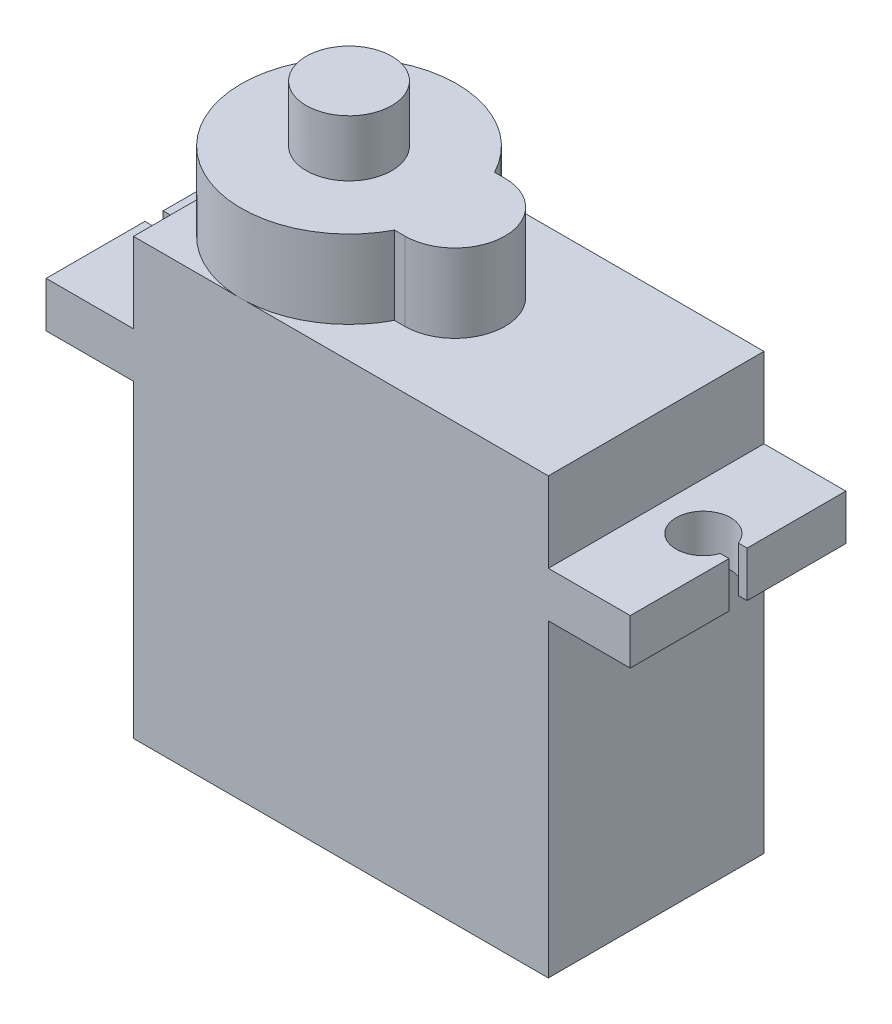
ISO-10303-21;
HEADER;
FILE_DESCRIPTION(('STEP AP214'),'2;1');
FILE_NAME('part.step','',(''),(''),'','','');
FILE_SCHEMA(('AUTOMOTIVE_DESIGN { 1 0 10303 214 1 1 1 1 }'));
ENDSEC;
DATA;
#1=APPLICATION_CONTEXT('core data for automotive mechanical design processes');
#2=APPLICATION_PROTOCOL_DEFINITION('international standard','automotive_design',2000,#1);
#3=PRODUCT_CONTEXT('',#1,'mechanical');
#4=PRODUCT('Part','Part','',(#3));
#5=PRODUCT_RELATED_PRODUCT_CATEGORY('part','',(#4));
#6=PRODUCT_DEFINITION_FORMATION('','',#4);
#7=PRODUCT_DEFINITION_CONTEXT('part definition',#1,'design');
#8=PRODUCT_DEFINITION('design','',#6,#7);
#9=PRODUCT_DEFINITION_SHAPE('','',#8);
#10=(LENGTH_UNIT() NAMED_UNIT(*) SI_UNIT(.MILLI.,.METRE.));
#11=(NAMED_UNIT(*) PLANE_ANGLE_UNIT() SI_UNIT($,.RADIAN.));
#12=(NAMED_UNIT(*) SI_UNIT($,.STERADIAN.) SOLID_ANGLE_UNIT());
#13=UNCERTAINTY_MEASURE_WITH_UNIT(LENGTH_MEASURE(1.E-05),#10,'distance_accuracy_value','');
#14=(GEOMETRIC_REPRESENTATION_CONTEXT(3) GLOBAL_UNCERTAINTY_ASSIGNED_CONTEXT((#13)) GLOBAL_UNIT_ASSIGNED_CONTEXT((#10,
#11,#12)) REPRESENTATION_CONTEXT('',''));
#15=CARTESIAN_POINT('',(0.,0.,0.));
#16=DIRECTION('',(0.,0.,1.));
#17=DIRECTION('',(1.,0.,0.));
#18=AXIS2_PLACEMENT_3D('',#15,#16,#17);
#19=CARTESIAN_POINT('',(-10.925,-4.4,11.85));
#20=DIRECTION('',(1.,0.,0.));
#21=DIRECTION('',(0.,0.,-1.));
#22=AXIS2_PLACEMENT_3D('',#19,#20,#21);
#23=PLANE('',#22);
#24=DIRECTION('',(0.,0.,-1.));
#25=VECTOR('',#24,1.);
#26=CARTESIAN_POINT('',(-10.925,-4.4,11.85));
#27=LINE('',#26,#25);
#28=CARTESIAN_POINT('',(-10.925,-4.4,11.85));
#29=VERTEX_POINT('',#28);
#30=CARTESIAN_POINT('',(-10.925,-4.40000000000001,6.425));
#31=VERTEX_POINT('',#30);
#32=EDGE_CURVE('E351',#29,#31,#27,.T.);
#33=ORIENTED_EDGE('',*,*,#32,.T.);
#34=DIRECTION('',(0.,1.,0.));
#35=VECTOR('',#34,1.);
#36=CARTESIAN_POINT('',(-10.925,-36.5,6.425));
#37=LINE('',#36,#35);
#38=CARTESIAN_POINT('',(-10.925,-6.9,6.425));
#39=VERTEX_POINT('',#38);
#40=EDGE_CURVE('E231',#39,#31,#37,.T.);
#41=ORIENTED_EDGE('',*,*,#40,.F.);
#42=DIRECTION('',(0.,0.,-1.));
#43=VECTOR('',#42,1.);
#44=CARTESIAN_POINT('',(-10.925,-6.9,11.85));
#45=LINE('',#44,#43);
#46=CARTESIAN_POINT('',(-10.925,-6.9,11.85));
#47=VERTEX_POINT('',#46);
#48=EDGE_CURVE('E343',#47,#39,#45,.T.);
#49=ORIENTED_EDGE('',*,*,#48,.F.);
#50=DIRECTION('',(0.,-1.,0.));
#51=VECTOR('',#50,1.);
#52=CARTESIAN_POINT('',(-10.925,-4.4,11.85));
#53=LINE('',#52,#51);
#54=EDGE_CURVE('E383',#29,#47,#53,.T.);
#55=ORIENTED_EDGE('',*,*,#54,.F.);
#56=EDGE_LOOP('',(#33,#41,#49,#55));
#57=FACE_BOUND('',#56,.T.);
#58=ADVANCED_FACE('F35',(#57),#23,.F.);
#59=CARTESIAN_POINT('',(21.175,-6.9,11.85));
#60=DIRECTION('',(-1.,0.,0.));
#61=DIRECTION('',(0.,0.,1.));
#62=AXIS2_PLACEMENT_3D('',#59,#60,#61);
#63=PLANE('',#62);
#64=DIRECTION('',(0.,0.,-1.));
#65=VECTOR('',#64,1.);
#66=CARTESIAN_POINT('',(21.175,-4.4,11.85));
#67=LINE('',#66,#65);
#68=CARTESIAN_POINT('',(21.175,-4.39999999999999,5.42499999999999));
#69=VERTEX_POINT('',#68);
#70=CARTESIAN_POINT('',(21.175,-4.4,0.));
#71=VERTEX_POINT('',#70);
#72=EDGE_CURVE('E432',#69,#71,#67,.T.);
#73=ORIENTED_EDGE('',*,*,#72,.F.);
#74=DIRECTION('',(0.,-1.,0.));
#75=VECTOR('',#74,1.);
#76=CARTESIAN_POINT('',(21.175,-6.9,5.42499999999999));
#77=LINE('',#76,#75);
#78=CARTESIAN_POINT('',(21.175,-6.9,5.42499999999999));
#79=VERTEX_POINT('',#78);
#80=EDGE_CURVE('E218',#69,#79,#77,.T.);
#81=ORIENTED_EDGE('',*,*,#80,.T.);
#82=DIRECTION('',(0.,0.,-1.));
#83=VECTOR('',#82,1.);
#84=CARTESIAN_POINT('',(21.175,-6.9,11.85));
#85=LINE('',#84,#83);
#86=CARTESIAN_POINT('',(21.175,-6.9,0.));
#87=VERTEX_POINT('',#86);
#88=EDGE_CURVE('E435',#79,#87,#85,.T.);
#89=ORIENTED_EDGE('',*,*,#88,.T.);
#90=DIRECTION('',(0.,1.,0.));
#91=VECTOR('',#90,1.);
#92=CARTESIAN_POINT('',(21.175,-6.9,0.));
#93=LINE('',#92,#91);
#94=EDGE_CURVE('E421',#87,#71,#93,.T.);
#95=ORIENTED_EDGE('',*,*,#94,.T.);
#96=EDGE_LOOP('',(#73,#81,#89,#95));
#97=FACE_BOUND('',#96,.T.);
#98=ADVANCED_FACE('F478',(#97),#63,.F.);
#99=CARTESIAN_POINT('',(0.,0.,11.85));
#100=DIRECTION('',(0.,-1.,0.));
#101=DIRECTION('',(1.,0.,0.));
#102=AXIS2_PLACEMENT_3D('',#99,#100,#101);
#103=PLANE('',#102);
#104=CARTESIAN_POINT('',(-0.200000000000001,0.,5.93));
#105=DIRECTION('',(0.,1.,0.));
#106=DIRECTION('',(-1.,0.,0.));
#107=AXIS2_PLACEMENT_3D('',#104,#105,#106);
#108=CIRCLE('',#107,5.925);
#109=CARTESIAN_POINT('',(0.0433618704728053,0.,11.85));
#110=VERTEX_POINT('',#109);
#111=CARTESIAN_POINT('',(5.0481544375142,0.,8.68));
#112=VERTEX_POINT('',#111);
#113=EDGE_CURVE('E287',#110,#112,#108,.T.);
#114=ORIENTED_EDGE('',*,*,#113,.F.);
#115=DIRECTION('',(-1.,0.,0.));
#116=VECTOR('',#115,1.);
#117=CARTESIAN_POINT('',(16.675,0.,11.85));
#118=LINE('',#117,#116);
#119=CARTESIAN_POINT('',(16.675,0.,11.85));
#120=VERTEX_POINT('',#119);
#121=EDGE_CURVE('E294',#120,#110,#118,.T.);
#122=ORIENTED_EDGE('',*,*,#121,.F.);
#123=DIRECTION('',(0.,0.,-1.));
#124=VECTOR('',#123,1.);
#125=CARTESIAN_POINT('',(16.675,0.,11.85));
#126=LINE('',#125,#124);
#127=CARTESIAN_POINT('',(16.675,0.,0.));
#128=VERTEX_POINT('',#127);
#129=EDGE_CURVE('E402',#120,#128,#126,.T.);
#130=ORIENTED_EDGE('',*,*,#129,.T.);
#131=DIRECTION('',(-1.,0.,0.));
#132=VECTOR('',#131,1.);
#133=CARTESIAN_POINT('',(0.,0.,0.));
#134=LINE('',#133,#132);
#135=CARTESIAN_POINT('',(-6.125,0.,0.));
#136=VERTEX_POINT('',#135);
#137=EDGE_CURVE('E376',#128,#136,#134,.T.);
#138=ORIENTED_EDGE('',*,*,#137,.T.);
#139=DIRECTION('',(0.,0.,-1.));
#140=VECTOR('',#139,1.);
#141=CARTESIAN_POINT('',(-6.125,0.,11.85));
#142=LINE('',#141,#140);
#143=CARTESIAN_POINT('',(-6.125,0.,5.93));
#144=VERTEX_POINT('',#143);
#145=EDGE_CURVE('E356',#144,#136,#142,.T.);
#146=ORIENTED_EDGE('',*,*,#145,.F.);
#147=CARTESIAN_POINT('',(5.0481544375142,0.,3.18));
#148=VERTEX_POINT('',#147);
#149=EDGE_CURVE('E276',#148,#144,#108,.T.);
#150=ORIENTED_EDGE('',*,*,#149,.F.);
#151=DIRECTION('',(-1.,0.,0.));
#152=VECTOR('',#151,1.);
#153=CARTESIAN_POINT('',(5.61999999999999,0.,3.18));
#154=LINE('',#153,#152);
#155=CARTESIAN_POINT('',(5.61999999999999,0.,3.18));
#156=VERTEX_POINT('',#155);
#157=EDGE_CURVE('E273',#156,#148,#154,.T.);
#158=ORIENTED_EDGE('',*,*,#157,.F.);
#159=CARTESIAN_POINT('',(5.62,0.,5.93));
#160=DIRECTION('',(0.,1.,0.));
#161=DIRECTION('',(-1.,0.,0.));
#162=AXIS2_PLACEMENT_3D('',#159,#160,#161);
#163=CIRCLE('',#162,2.75);
#164=CARTESIAN_POINT('',(5.62000000000003,0.,8.68));
#165=VERTEX_POINT('',#164);
#166=EDGE_CURVE('E259',#165,#156,#163,.T.);
#167=ORIENTED_EDGE('',*,*,#166,.F.);
#168=DIRECTION('',(1.,0.,0.));
#169=VECTOR('',#168,1.);
#170=CARTESIAN_POINT('',(5.62000000000003,0.,8.68));
#171=LINE('',#170,#169);
#172=EDGE_CURVE('E264',#112,#165,#171,.T.);
#173=ORIENTED_EDGE('',*,*,#172,.F.);
#174=EDGE_LOOP('',(#114,#122,#130,#138,#146,#150,#158,#167,#173));
#175=FACE_BOUND('',#174,.T.);
#176=ADVANCED_FACE('F37',(#175),#103,.F.);
#177=CARTESIAN_POINT('',(-0.443361870472808,0.,11.85));
#178=VERTEX_POINT('',#177);
#179=EDGE_CURVE('E283',#144,#178,#108,.T.);
#180=ORIENTED_EDGE('',*,*,#179,.F.);
#181=CARTESIAN_POINT('',(-6.125,0.,11.85));
#182=VERTEX_POINT('',#181);
#183=EDGE_CURVE('E357',#182,#144,#142,.T.);
#184=ORIENTED_EDGE('',*,*,#183,.F.);
#185=EDGE_CURVE('E308',#178,#182,#118,.T.);
#186=ORIENTED_EDGE('',*,*,#185,.F.);
#187=EDGE_LOOP('',(#180,#184,#186));
#188=FACE_BOUND('',#187,.T.);
#189=ADVANCED_FACE('F371',(#188),#103,.F.);
#190=CARTESIAN_POINT('',(-6.125,0.,11.85));
#191=DIRECTION('',(1.,0.,0.));
#192=DIRECTION('',(0.,0.,-1.));
#193=AXIS2_PLACEMENT_3D('',#190,#191,#192);
#194=PLANE('',#193);
#195=DIRECTION('',(0.,-1.,0.));
#196=VECTOR('',#195,1.);
#197=CARTESIAN_POINT('',(-6.125,0.,0.));
#198=LINE('',#197,#196);
#199=CARTESIAN_POINT('',(-6.125,-4.4,0.));
#200=VERTEX_POINT('',#199);
#201=EDGE_CURVE('E404',#136,#200,#198,.T.);
#202=ORIENTED_EDGE('',*,*,#201,.T.);
#203=DIRECTION('',(0.,0.,-1.));
#204=VECTOR('',#203,1.);
#205=CARTESIAN_POINT('',(-6.125,-4.4,11.85));
#206=LINE('',#205,#204);
#207=CARTESIAN_POINT('',(-6.125,-4.4,11.85));
#208=VERTEX_POINT('',#207);
#209=EDGE_CURVE('E353',#208,#200,#206,.T.);
#210=ORIENTED_EDGE('',*,*,#209,.F.);
#211=DIRECTION('',(0.,-1.,0.));
#212=VECTOR('',#211,1.);
#213=CARTESIAN_POINT('',(-6.125,0.,11.85));
#214=LINE('',#213,#212);
#215=EDGE_CURVE('E297',#182,#208,#214,.T.);
#216=ORIENTED_EDGE('',*,*,#215,.F.);
#217=ORIENTED_EDGE('',*,*,#183,.T.);
#218=ORIENTED_EDGE('',*,*,#145,.T.);
#219=EDGE_LOOP('',(#202,#210,#216,#217,#218));
#220=FACE_BOUND('',#219,.T.);
#221=ADVANCED_FACE('F379',(#220),#194,.F.);
#222=CARTESIAN_POINT('',(-6.125,-4.4,11.85));
#223=DIRECTION('',(0.,-1.,0.));
#224=DIRECTION('',(1.,0.,0.));
#225=AXIS2_PLACEMENT_3D('',#222,#223,#224);
#226=PLANE('',#225);
#227=CARTESIAN_POINT('',(-8.725,-4.4,5.93));
#228=DIRECTION('',(0.,1.,0.));
#229=DIRECTION('',(-1.,0.,0.));
#230=AXIS2_PLACEMENT_3D('',#227,#228,#229);
#231=CIRCLE('',#230,1.5);
#232=CARTESIAN_POINT('',(-10.1409713980162,-4.40000000000001,6.425));
#233=VERTEX_POINT('',#232);
#234=CARTESIAN_POINT('',(-10.1374358392508,-4.40000000000001,5.425));
#235=VERTEX_POINT('',#234);
#236=EDGE_CURVE('E235',#233,#235,#231,.T.);
#237=ORIENTED_EDGE('',*,*,#236,.F.);
#238=DIRECTION('',(1.,0.,0.));
#239=VECTOR('',#238,1.);
#240=CARTESIAN_POINT('',(-10.925,-4.40000000000001,6.425));
#241=LINE('',#240,#239);
#242=EDGE_CURVE('E240',#31,#233,#241,.T.);
#243=ORIENTED_EDGE('',*,*,#242,.F.);
#244=ORIENTED_EDGE('',*,*,#32,.F.);
#245=DIRECTION('',(-1.,0.,0.));
#246=VECTOR('',#245,1.);
#247=CARTESIAN_POINT('',(-6.125,-4.4,11.85));
#248=LINE('',#247,#246);
#249=EDGE_CURVE('E382',#208,#29,#248,.T.);
#250=ORIENTED_EDGE('',*,*,#249,.F.);
#251=ORIENTED_EDGE('',*,*,#209,.T.);
#252=DIRECTION('',(-1.,0.,0.));
#253=VECTOR('',#252,1.);
#254=CARTESIAN_POINT('',(-6.125,-4.4,0.));
#255=LINE('',#254,#253);
#256=CARTESIAN_POINT('',(-10.925,-4.4,0.));
#257=VERTEX_POINT('',#256);
#258=EDGE_CURVE('E407',#200,#257,#255,.T.);
#259=ORIENTED_EDGE('',*,*,#258,.T.);
#260=CARTESIAN_POINT('',(-10.925,-4.40000000000001,5.425));
#261=VERTEX_POINT('',#260);
#262=EDGE_CURVE('E334',#261,#257,#27,.T.);
#263=ORIENTED_EDGE('',*,*,#262,.F.);
#264=DIRECTION('',(-1.,0.,0.));
#265=VECTOR('',#264,1.);
#266=CARTESIAN_POINT('',(-10.1374358392508,-4.40000000000001,5.425));
#267=LINE('',#266,#265);
#268=EDGE_CURVE('E238',#235,#261,#267,.T.);
#269=ORIENTED_EDGE('',*,*,#268,.F.);
#270=EDGE_LOOP('',(#237,#243,#244,#250,#251,#259,#263,#269));
#271=FACE_BOUND('',#270,.T.);
#272=ADVANCED_FACE('F331',(#271),#226,.F.);
#273=CARTESIAN_POINT('',(-10.925,-6.9,5.425));
#274=VERTEX_POINT('',#273);
#275=CARTESIAN_POINT('',(-10.925,-6.9,0.));
#276=VERTEX_POINT('',#275);
#277=EDGE_CURVE('E339',#274,#276,#45,.T.);
#278=ORIENTED_EDGE('',*,*,#277,.F.);
#279=DIRECTION('',(0.,1.,0.));
#280=VECTOR('',#279,1.);
#281=CARTESIAN_POINT('',(-10.925,-36.5,5.425));
#282=LINE('',#281,#280);
#283=EDGE_CURVE('E50',#274,#261,#282,.T.);
#284=ORIENTED_EDGE('',*,*,#283,.T.);
#285=ORIENTED_EDGE('',*,*,#262,.T.);
#286=DIRECTION('',(0.,-1.,0.));
#287=VECTOR('',#286,1.);
#288=CARTESIAN_POINT('',(-10.925,-4.4,0.));
#289=LINE('',#288,#287);
#290=EDGE_CURVE('E341',#257,#276,#289,.T.);
#291=ORIENTED_EDGE('',*,*,#290,.T.);
#292=EDGE_LOOP('',(#278,#284,#285,#291));
#293=FACE_BOUND('',#292,.T.);
#294=ADVANCED_FACE('F337',(#293),#23,.F.);
#295=CARTESIAN_POINT('',(-10.925,-6.9,11.85));
#296=DIRECTION('',(0.,1.,0.));
#297=DIRECTION('',(0.,0.,1.));
#298=AXIS2_PLACEMENT_3D('',#295,#296,#297);
#299=PLANE('',#298);
#300=ORIENTED_EDGE('',*,*,#48,.T.);
#301=DIRECTION('',(1.,0.,0.));
#302=VECTOR('',#301,1.);
#303=CARTESIAN_POINT('',(-10.925,-6.9,6.425));
#304=LINE('',#303,#302);
#305=CARTESIAN_POINT('',(-10.1409713980162,-6.9,6.425));
#306=VERTEX_POINT('',#305);
#307=EDGE_CURVE('E11',#39,#306,#304,.T.);
#308=ORIENTED_EDGE('',*,*,#307,.T.);
#309=CARTESIAN_POINT('',(-8.725,-6.9,5.93));
#310=DIRECTION('',(0.,1.,0.));
#311=DIRECTION('',(0.,0.,1.));
#312=AXIS2_PLACEMENT_3D('',#309,#310,#311);
#313=CIRCLE('',#312,1.5);
#314=CARTESIAN_POINT('',(-10.1374358392508,-6.9,5.425));
#315=VERTEX_POINT('',#314);
#316=EDGE_CURVE('E43',#306,#315,#313,.T.);
#317=ORIENTED_EDGE('',*,*,#316,.T.);
#318=DIRECTION('',(-1.,0.,0.));
#319=VECTOR('',#318,1.);
#320=CARTESIAN_POINT('',(-10.925,-6.9,5.425));
#321=LINE('',#320,#319);
#322=EDGE_CURVE('E221',#315,#274,#321,.T.);
#323=ORIENTED_EDGE('',*,*,#322,.T.);
#324=ORIENTED_EDGE('',*,*,#277,.T.);
#325=DIRECTION('',(1.,0.,0.));
#326=VECTOR('',#325,1.);
#327=CARTESIAN_POINT('',(-10.925,-6.9,0.));
#328=LINE('',#327,#326);
#329=CARTESIAN_POINT('',(-6.125,-6.9,0.));
#330=VERTEX_POINT('',#329);
#331=EDGE_CURVE('E410',#276,#330,#328,.T.);
#332=ORIENTED_EDGE('',*,*,#331,.T.);
#333=DIRECTION('',(0.,0.,-1.));
#334=VECTOR('',#333,1.);
#335=CARTESIAN_POINT('',(-6.125,-6.9,11.85));
#336=LINE('',#335,#334);
#337=CARTESIAN_POINT('',(-6.125,-6.9,11.85));
#338=VERTEX_POINT('',#337);
#339=EDGE_CURVE('E344',#338,#330,#336,.T.);
#340=ORIENTED_EDGE('',*,*,#339,.F.);
#341=DIRECTION('',(1.,0.,0.));
#342=VECTOR('',#341,1.);
#343=CARTESIAN_POINT('',(-10.925,-6.9,11.85));
#344=LINE('',#343,#342);
#345=EDGE_CURVE('E384',#47,#338,#344,.T.);
#346=ORIENTED_EDGE('',*,*,#345,.F.);
#347=EDGE_LOOP('',(#300,#308,#317,#323,#324,#332,#340,#346));
#348=FACE_BOUND('',#347,.T.);
#349=ADVANCED_FACE('F316',(#348),#299,.F.);
#350=CARTESIAN_POINT('',(-6.125,-6.9,11.85));
#351=DIRECTION('',(1.,0.,0.));
#352=DIRECTION('',(0.,1.,0.));
#353=AXIS2_PLACEMENT_3D('',#350,#351,#352);
#354=PLANE('',#353);
#355=DIRECTION('',(0.,-1.,0.));
#356=VECTOR('',#355,1.);
#357=CARTESIAN_POINT('',(-6.125,-6.9,0.));
#358=LINE('',#357,#356);
#359=CARTESIAN_POINT('',(-6.125,-23.9,0.));
#360=VERTEX_POINT('',#359);
#361=EDGE_CURVE('E412',#330,#360,#358,.T.);
#362=ORIENTED_EDGE('',*,*,#361,.T.);
#363=DIRECTION('',(0.,0.,-1.));
#364=VECTOR('',#363,1.);
#365=CARTESIAN_POINT('',(-6.125,-23.9,11.85));
#366=LINE('',#365,#364);
#367=CARTESIAN_POINT('',(-6.125,-23.9,11.85));
#368=VERTEX_POINT('',#367);
#369=EDGE_CURVE('E347',#368,#360,#366,.T.);
#370=ORIENTED_EDGE('',*,*,#369,.F.);
#371=DIRECTION('',(0.,-1.,0.));
#372=VECTOR('',#371,1.);
#373=CARTESIAN_POINT('',(-6.125,-6.9,11.85));
#374=LINE('',#373,#372);
#375=EDGE_CURVE('E388',#338,#368,#374,.T.);
#376=ORIENTED_EDGE('',*,*,#375,.F.);
#377=ORIENTED_EDGE('',*,*,#339,.T.);
#378=EDGE_LOOP('',(#362,#370,#376,#377));
#379=FACE_BOUND('',#378,.T.);
#380=ADVANCED_FACE('F472',(#379),#354,.F.);
#381=CARTESIAN_POINT('',(-6.125,-23.9,11.85));
#382=DIRECTION('',(0.,1.,0.));
#383=DIRECTION('',(-1.,0.,0.));
#384=AXIS2_PLACEMENT_3D('',#381,#382,#383);
#385=PLANE('',#384);
#386=DIRECTION('',(1.,0.,0.));
#387=VECTOR('',#386,1.);
#388=CARTESIAN_POINT('',(-6.125,-23.9,0.));
#389=LINE('',#388,#387);
#390=CARTESIAN_POINT('',(16.675,-23.9,0.));
#391=VERTEX_POINT('',#390);
#392=EDGE_CURVE('E414',#360,#391,#389,.T.);
#393=ORIENTED_EDGE('',*,*,#392,.T.);
#394=DIRECTION('',(0.,0.,-1.));
#395=VECTOR('',#394,1.);
#396=CARTESIAN_POINT('',(16.675,-23.9,11.85));
#397=LINE('',#396,#395);
#398=CARTESIAN_POINT('',(16.675,-23.9,11.85));
#399=VERTEX_POINT('',#398);
#400=EDGE_CURVE('E442',#399,#391,#397,.T.);
#401=ORIENTED_EDGE('',*,*,#400,.F.);
#402=DIRECTION('',(1.,0.,0.));
#403=VECTOR('',#402,1.);
#404=CARTESIAN_POINT('',(-6.125,-23.9,11.85));
#405=LINE('',#404,#403);
#406=EDGE_CURVE('E390',#368,#399,#405,.T.);
#407=ORIENTED_EDGE('',*,*,#406,.F.);
#408=ORIENTED_EDGE('',*,*,#369,.T.);
#409=EDGE_LOOP('',(#393,#401,#407,#408));
#410=FACE_BOUND('',#409,.T.);
#411=ADVANCED_FACE('F449',(#410),#385,.F.);
#412=CARTESIAN_POINT('',(16.675,-23.9,11.85));
#413=DIRECTION('',(-1.,0.,0.));
#414=DIRECTION('',(0.,0.,1.));
#415=AXIS2_PLACEMENT_3D('',#412,#413,#414);
#416=PLANE('',#415);
#417=DIRECTION('',(0.,1.,0.));
#418=VECTOR('',#417,1.);
#419=CARTESIAN_POINT('',(16.675,-23.9,0.));
#420=LINE('',#419,#418);
#421=CARTESIAN_POINT('',(16.675,-6.9,0.));
#422=VERTEX_POINT('',#421);
#423=EDGE_CURVE('E416',#391,#422,#420,.T.);
#424=ORIENTED_EDGE('',*,*,#423,.T.);
#425=DIRECTION('',(0.,0.,-1.));
#426=VECTOR('',#425,1.);
#427=CARTESIAN_POINT('',(16.675,-6.9,11.85));
#428=LINE('',#427,#426);
#429=CARTESIAN_POINT('',(16.675,-6.9,11.85));
#430=VERTEX_POINT('',#429);
#431=EDGE_CURVE('E439',#430,#422,#428,.T.);
#432=ORIENTED_EDGE('',*,*,#431,.F.);
#433=DIRECTION('',(0.,1.,0.));
#434=VECTOR('',#433,1.);
#435=CARTESIAN_POINT('',(16.675,-23.9,11.85));
#436=LINE('',#435,#434);
#437=EDGE_CURVE('E392',#399,#430,#436,.T.);
#438=ORIENTED_EDGE('',*,*,#437,.F.);
#439=ORIENTED_EDGE('',*,*,#400,.T.);
#440=EDGE_LOOP('',(#424,#432,#438,#439));
#441=FACE_BOUND('',#440,.T.);
#442=ADVANCED_FACE('F461',(#441),#416,.F.);
#443=CARTESIAN_POINT('',(16.675,-6.9,11.85));
#444=DIRECTION('',(0.,1.,0.));
#445=DIRECTION('',(0.,0.,1.));
#446=AXIS2_PLACEMENT_3D('',#443,#444,#445);
#447=PLANE('',#446);
#448=ORIENTED_EDGE('',*,*,#88,.F.);
#449=DIRECTION('',(-1.,0.,0.));
#450=VECTOR('',#449,1.);
#451=CARTESIAN_POINT('',(16.675,-6.9,5.42499999999999));
#452=LINE('',#451,#450);
#453=CARTESIAN_POINT('',(20.6874358392508,-6.9,5.42499999999999));
#454=VERTEX_POINT('',#453);
#455=EDGE_CURVE('E253',#79,#454,#452,.T.);
#456=ORIENTED_EDGE('',*,*,#455,.T.);
#457=CARTESIAN_POINT('',(19.275,-6.9,5.93));
#458=DIRECTION('',(0.,1.,0.));
#459=DIRECTION('',(0.,0.,1.));
#460=AXIS2_PLACEMENT_3D('',#457,#458,#459);
#461=CIRCLE('',#460,1.5);
#462=CARTESIAN_POINT('',(20.6909713980162,-6.9,6.425));
#463=VERTEX_POINT('',#462);
#464=EDGE_CURVE('E208',#454,#463,#461,.T.);
#465=ORIENTED_EDGE('',*,*,#464,.T.);
#466=DIRECTION('',(1.,0.,0.));
#467=VECTOR('',#466,1.);
#468=CARTESIAN_POINT('',(16.675,-6.9,6.425));
#469=LINE('',#468,#467);
#470=CARTESIAN_POINT('',(21.175,-6.9,6.425));
#471=VERTEX_POINT('',#470);
#472=EDGE_CURVE('E249',#463,#471,#469,.T.);
#473=ORIENTED_EDGE('',*,*,#472,.T.);
#474=CARTESIAN_POINT('',(21.175,-6.9,11.85));
#475=VERTEX_POINT('',#474);
#476=EDGE_CURVE('E436',#475,#471,#85,.T.);
#477=ORIENTED_EDGE('',*,*,#476,.F.);
#478=DIRECTION('',(1.,0.,0.));
#479=VECTOR('',#478,1.);
#480=CARTESIAN_POINT('',(16.675,-6.9,11.85));
#481=LINE('',#480,#479);
#482=EDGE_CURVE('E394',#430,#475,#481,.T.);
#483=ORIENTED_EDGE('',*,*,#482,.F.);
#484=ORIENTED_EDGE('',*,*,#431,.T.);
#485=DIRECTION('',(1.,0.,0.));
#486=VECTOR('',#485,1.);
#487=CARTESIAN_POINT('',(16.675,-6.9,0.));
#488=LINE('',#487,#486);
#489=EDGE_CURVE('E418',#422,#87,#488,.T.);
#490=ORIENTED_EDGE('',*,*,#489,.T.);
#491=EDGE_LOOP('',(#448,#456,#465,#473,#477,#483,#484,#490));
#492=FACE_BOUND('',#491,.T.);
#493=ADVANCED_FACE('F466',(#492),#447,.F.);
#494=ORIENTED_EDGE('',*,*,#476,.T.);
#495=DIRECTION('',(0.,1.,0.));
#496=VECTOR('',#495,1.);
#497=CARTESIAN_POINT('',(21.175,-6.9,6.425));
#498=LINE('',#497,#496);
#499=CARTESIAN_POINT('',(21.175,-4.39999999999999,6.425));
#500=VERTEX_POINT('',#499);
#501=EDGE_CURVE('E211',#471,#500,#498,.T.);
#502=ORIENTED_EDGE('',*,*,#501,.T.);
#503=CARTESIAN_POINT('',(21.175,-4.4,11.85));
#504=VERTEX_POINT('',#503);
#505=EDGE_CURVE('E433',#504,#500,#67,.T.);
#506=ORIENTED_EDGE('',*,*,#505,.F.);
#507=DIRECTION('',(0.,1.,0.));
#508=VECTOR('',#507,1.);
#509=CARTESIAN_POINT('',(21.175,-6.9,11.85));
#510=LINE('',#509,#508);
#511=EDGE_CURVE('E396',#475,#504,#510,.T.);
#512=ORIENTED_EDGE('',*,*,#511,.F.);
#513=EDGE_LOOP('',(#494,#502,#506,#512));
#514=FACE_BOUND('',#513,.T.);
#515=ADVANCED_FACE('F485',(#514),#63,.F.);
#516=CARTESIAN_POINT('',(21.175,-4.4,11.85));
#517=DIRECTION('',(0.,-1.,0.));
#518=DIRECTION('',(1.,0.,0.));
#519=AXIS2_PLACEMENT_3D('',#516,#517,#518);
#520=PLANE('',#519);
#521=CARTESIAN_POINT('',(19.275,-4.39999999999999,5.93));
#522=DIRECTION('',(0.,1.,0.));
#523=DIRECTION('',(1.,0.,0.));
#524=AXIS2_PLACEMENT_3D('',#521,#522,#523);
#525=CIRCLE('',#524,1.5);
#526=CARTESIAN_POINT('',(20.6874358392508,-4.39999999999999,5.42499999999999));
#527=VERTEX_POINT('',#526);
#528=CARTESIAN_POINT('',(20.6909713980162,-4.4,6.425));
#529=VERTEX_POINT('',#528);
#530=EDGE_CURVE('E58',#527,#529,#525,.T.);
#531=ORIENTED_EDGE('',*,*,#530,.F.);
#532=DIRECTION('',(1.,0.,0.));
#533=VECTOR('',#532,1.);
#534=CARTESIAN_POINT('',(21.175,-4.4,5.42499999999999));
#535=LINE('',#534,#533);
#536=EDGE_CURVE('E215',#527,#69,#535,.T.);
#537=ORIENTED_EDGE('',*,*,#536,.T.);
#538=ORIENTED_EDGE('',*,*,#72,.T.);
#539=DIRECTION('',(-1.,0.,0.));
#540=VECTOR('',#539,1.);
#541=CARTESIAN_POINT('',(21.175,-4.4,0.));
#542=LINE('',#541,#540);
#543=CARTESIAN_POINT('',(16.675,-4.4,0.));
#544=VERTEX_POINT('',#543);
#545=EDGE_CURVE('E424',#71,#544,#542,.T.);
#546=ORIENTED_EDGE('',*,*,#545,.T.);
#547=DIRECTION('',(0.,0.,-1.));
#548=VECTOR('',#547,1.);
#549=CARTESIAN_POINT('',(16.675,-4.4,11.85));
#550=LINE('',#549,#548);
#551=CARTESIAN_POINT('',(16.675,-4.4,11.85));
#552=VERTEX_POINT('',#551);
#553=EDGE_CURVE('E429',#552,#544,#550,.T.);
#554=ORIENTED_EDGE('',*,*,#553,.F.);
#555=DIRECTION('',(-1.,0.,0.));
#556=VECTOR('',#555,1.);
#557=CARTESIAN_POINT('',(21.175,-4.4,11.85));
#558=LINE('',#557,#556);
#559=EDGE_CURVE('E398',#504,#552,#558,.T.);
#560=ORIENTED_EDGE('',*,*,#559,.F.);
#561=ORIENTED_EDGE('',*,*,#505,.T.);
#562=DIRECTION('',(1.,0.,0.));
#563=VECTOR('',#562,1.);
#564=CARTESIAN_POINT('',(21.475,-4.39999999999999,6.425));
#565=LINE('',#564,#563);
#566=EDGE_CURVE('E227',#529,#500,#565,.T.);
#567=ORIENTED_EDGE('',*,*,#566,.F.);
#568=EDGE_LOOP('',(#531,#537,#538,#546,#554,#560,#561,#567));
#569=FACE_BOUND('',#568,.T.);
#570=ADVANCED_FACE('F225',(#569),#520,.F.);
#571=CARTESIAN_POINT('',(16.675,-4.4,11.85));
#572=DIRECTION('',(-1.,0.,0.));
#573=DIRECTION('',(0.,0.,1.));
#574=AXIS2_PLACEMENT_3D('',#571,#572,#573);
#575=PLANE('',#574);
#576=DIRECTION('',(0.,1.,0.));
#577=VECTOR('',#576,1.);
#578=CARTESIAN_POINT('',(16.675,-4.4,0.));
#579=LINE('',#578,#577);
#580=EDGE_CURVE('E310',#544,#128,#579,.T.);
#581=ORIENTED_EDGE('',*,*,#580,.T.);
#582=ORIENTED_EDGE('',*,*,#129,.F.);
#583=DIRECTION('',(0.,1.,0.));
#584=VECTOR('',#583,1.);
#585=CARTESIAN_POINT('',(16.675,-4.4,11.85));
#586=LINE('',#585,#584);
#587=EDGE_CURVE('E400',#552,#120,#586,.T.);
#588=ORIENTED_EDGE('',*,*,#587,.F.);
#589=ORIENTED_EDGE('',*,*,#553,.T.);
#590=EDGE_LOOP('',(#581,#582,#588,#589));
#591=FACE_BOUND('',#590,.T.);
#592=ADVANCED_FACE('F557',(#591),#575,.F.);
#593=CARTESIAN_POINT('',(0.,0.,11.85));
#594=DIRECTION('',(0.,0.,1.));
#595=DIRECTION('',(1.,0.,0.));
#596=AXIS2_PLACEMENT_3D('',#593,#594,#595);
#597=PLANE('',#596);
#598=ORIENTED_EDGE('',*,*,#121,.T.);
#599=CARTESIAN_POINT('',(0.0433618704728053,0.,11.85));
#600=DIRECTION('',(-1.,0.,0.));
#601=VECTOR('',#600,1.);
#602=LINE('',#599,#601);
#603=EDGE_CURVE('E298',#110,#178,#602,.T.);
#604=ORIENTED_EDGE('',*,*,#603,.T.);
#605=ORIENTED_EDGE('',*,*,#185,.T.);
#606=ORIENTED_EDGE('',*,*,#215,.T.);
#607=ORIENTED_EDGE('',*,*,#249,.T.);
#608=ORIENTED_EDGE('',*,*,#54,.T.);
#609=ORIENTED_EDGE('',*,*,#345,.T.);
#610=ORIENTED_EDGE('',*,*,#375,.T.);
#611=ORIENTED_EDGE('',*,*,#406,.T.);
#612=ORIENTED_EDGE('',*,*,#437,.T.);
#613=ORIENTED_EDGE('',*,*,#482,.T.);
#614=ORIENTED_EDGE('',*,*,#511,.T.);
#615=ORIENTED_EDGE('',*,*,#559,.T.);
#616=ORIENTED_EDGE('',*,*,#587,.T.);
#617=EDGE_LOOP('',(#598,#604,#605,#606,#607,#608,#609,#610,#611,#612,#613,#614,#615,#616));
#618=FACE_BOUND('',#617,.T.);
#619=ADVANCED_FACE('F363',(#618),#597,.T.);
#620=CARTESIAN_POINT('',(0.,0.,0.));
#621=DIRECTION('',(0.,0.,1.));
#622=DIRECTION('',(1.,0.,0.));
#623=AXIS2_PLACEMENT_3D('',#620,#621,#622);
#624=PLANE('',#623);
#625=ORIENTED_EDGE('',*,*,#137,.F.);
#626=ORIENTED_EDGE('',*,*,#580,.F.);
#627=ORIENTED_EDGE('',*,*,#545,.F.);
#628=ORIENTED_EDGE('',*,*,#94,.F.);
#629=ORIENTED_EDGE('',*,*,#489,.F.);
#630=ORIENTED_EDGE('',*,*,#423,.F.);
#631=ORIENTED_EDGE('',*,*,#392,.F.);
#632=ORIENTED_EDGE('',*,*,#361,.F.);
#633=ORIENTED_EDGE('',*,*,#331,.F.);
#634=ORIENTED_EDGE('',*,*,#290,.F.);
#635=ORIENTED_EDGE('',*,*,#258,.F.);
#636=ORIENTED_EDGE('',*,*,#201,.F.);
#637=EDGE_LOOP('',(#625,#626,#627,#628,#629,#630,#631,#632,#633,#634,#635,#636));
#638=FACE_BOUND('',#637,.T.);
#639=ADVANCED_FACE('F456',(#638),#624,.F.);
#640=CARTESIAN_POINT('',(5.62,4.3,5.93));
#641=DIRECTION('',(0.,-1.,0.));
#642=DIRECTION('',(1.,0.,0.));
#643=AXIS2_PLACEMENT_3D('',#640,#641,#642);
#644=CYLINDRICAL_SURFACE('',#643,2.75);
#645=ORIENTED_EDGE('',*,*,#166,.T.);
#646=DIRECTION('',(0.,-1.,0.));
#647=VECTOR('',#646,1.);
#648=CARTESIAN_POINT('',(5.61999999999999,4.3,3.18));
#649=LINE('',#648,#647);
#650=CARTESIAN_POINT('',(5.61999999999999,4.3,3.18));
#651=VERTEX_POINT('',#650);
#652=EDGE_CURVE('E405',#651,#156,#649,.T.);
#653=ORIENTED_EDGE('',*,*,#652,.F.);
#654=CARTESIAN_POINT('',(5.62,4.3,5.93));
#655=DIRECTION('',(0.,1.,0.));
#656=DIRECTION('',(-1.,0.,0.));
#657=AXIS2_PLACEMENT_3D('',#654,#655,#656);
#658=CIRCLE('',#657,2.75);
#659=CARTESIAN_POINT('',(5.62000000000003,4.3,8.68));
#660=VERTEX_POINT('',#659);
#661=EDGE_CURVE('E260',#660,#651,#658,.T.);
#662=ORIENTED_EDGE('',*,*,#661,.F.);
#663=DIRECTION('',(0.,-1.,0.));
#664=VECTOR('',#663,1.);
#665=CARTESIAN_POINT('',(5.62000000000003,4.3,8.68));
#666=LINE('',#665,#664);
#667=EDGE_CURVE('E270',#660,#165,#666,.T.);
#668=ORIENTED_EDGE('',*,*,#667,.T.);
#669=EDGE_LOOP('',(#645,#653,#662,#668));
#670=FACE_BOUND('',#669,.T.);
#671=ADVANCED_FACE('F635',(#670),#644,.T.);
#672=CARTESIAN_POINT('',(5.61999999999999,4.3,3.18));
#673=DIRECTION('',(0.,0.,1.));
#674=DIRECTION('',(1.,0.,0.));
#675=AXIS2_PLACEMENT_3D('',#672,#673,#674);
#676=PLANE('',#675);
#677=ORIENTED_EDGE('',*,*,#157,.T.);
#678=DIRECTION('',(0.,-1.,0.));
#679=VECTOR('',#678,1.);
#680=CARTESIAN_POINT('',(5.0481544375142,4.3,3.18));
#681=LINE('',#680,#679);
#682=CARTESIAN_POINT('',(5.0481544375142,4.3,3.18));
#683=VERTEX_POINT('',#682);
#684=EDGE_CURVE('E749',#683,#148,#681,.T.);
#685=ORIENTED_EDGE('',*,*,#684,.F.);
#686=DIRECTION('',(-1.,0.,0.));
#687=VECTOR('',#686,1.);
#688=CARTESIAN_POINT('',(5.61999999999999,4.3,3.18));
#689=LINE('',#688,#687);
#690=EDGE_CURVE('E263',#651,#683,#689,.T.);
#691=ORIENTED_EDGE('',*,*,#690,.F.);
#692=ORIENTED_EDGE('',*,*,#652,.T.);
#693=EDGE_LOOP('',(#677,#685,#691,#692));
#694=FACE_BOUND('',#693,.T.);
#695=ADVANCED_FACE('F632',(#694),#676,.F.);
#696=CARTESIAN_POINT('',(-0.200000000000002,4.3,5.93));
#697=DIRECTION('',(0.,-1.,0.));
#698=DIRECTION('',(1.,0.,0.));
#699=AXIS2_PLACEMENT_3D('',#696,#697,#698);
#700=CYLINDRICAL_SURFACE('',#699,5.925);
#701=ORIENTED_EDGE('',*,*,#149,.T.);
#702=ORIENTED_EDGE('',*,*,#179,.T.);
#703=ORIENTED_EDGE('',*,*,#603,.F.);
#704=ORIENTED_EDGE('',*,*,#113,.T.);
#705=DIRECTION('',(0.,-1.,0.));
#706=VECTOR('',#705,1.);
#707=CARTESIAN_POINT('',(5.0481544375142,4.3,8.68));
#708=LINE('',#707,#706);
#709=CARTESIAN_POINT('',(5.0481544375142,4.3,8.68));
#710=VERTEX_POINT('',#709);
#711=EDGE_CURVE('E745',#710,#112,#708,.T.);
#712=ORIENTED_EDGE('',*,*,#711,.F.);
#713=CARTESIAN_POINT('',(-0.200000000000002,4.3,5.93));
#714=DIRECTION('',(0.,1.,0.));
#715=DIRECTION('',(-1.,0.,0.));
#716=AXIS2_PLACEMENT_3D('',#713,#714,#715);
#717=CIRCLE('',#716,5.925);
#718=EDGE_CURVE('E266',#683,#710,#717,.T.);
#719=ORIENTED_EDGE('',*,*,#718,.F.);
#720=ORIENTED_EDGE('',*,*,#684,.T.);
#721=EDGE_LOOP('',(#701,#702,#703,#704,#712,#719,#720));
#722=FACE_BOUND('',#721,.T.);
#723=ADVANCED_FACE('F367',(#722),#700,.T.);
#724=CARTESIAN_POINT('',(5.62000000000003,4.3,8.68));
#725=DIRECTION('',(0.,0.,-1.));
#726=DIRECTION('',(-1.,0.,0.));
#727=AXIS2_PLACEMENT_3D('',#724,#725,#726);
#728=PLANE('',#727);
#729=ORIENTED_EDGE('',*,*,#172,.T.);
#730=ORIENTED_EDGE('',*,*,#667,.F.);
#731=DIRECTION('',(1.,0.,0.));
#732=VECTOR('',#731,1.);
#733=CARTESIAN_POINT('',(5.62000000000003,4.3,8.68));
#734=LINE('',#733,#732);
#735=EDGE_CURVE('E268',#710,#660,#734,.T.);
#736=ORIENTED_EDGE('',*,*,#735,.F.);
#737=ORIENTED_EDGE('',*,*,#711,.T.);
#738=EDGE_LOOP('',(#729,#730,#736,#737));
#739=FACE_BOUND('',#738,.T.);
#740=ADVANCED_FACE('F625',(#739),#728,.F.);
#741=CARTESIAN_POINT('',(5.62,4.3,5.93));
#742=DIRECTION('',(0.,1.,0.));
#743=DIRECTION('',(-1.,0.,0.));
#744=AXIS2_PLACEMENT_3D('',#741,#742,#743);
#745=PLANE('',#744);
#746=CARTESIAN_POINT('',(-0.200000000000002,4.3,5.93));
#747=DIRECTION('',(0.,1.,0.));
#748=DIRECTION('',(-1.,0.,0.));
#749=AXIS2_PLACEMENT_3D('',#746,#747,#748);
#750=CIRCLE('',#749,2.35);
#751=CARTESIAN_POINT('',(-2.55,4.3,5.93));
#752=VERTEX_POINT('',#751);
#753=EDGE_CURVE('E222',#752,#752,#750,.T.);
#754=ORIENTED_EDGE('',*,*,#753,.F.);
#755=EDGE_LOOP('',(#754));
#756=FACE_BOUND('',#755,.T.);
#757=ORIENTED_EDGE('',*,*,#661,.T.);
#758=ORIENTED_EDGE('',*,*,#690,.T.);
#759=ORIENTED_EDGE('',*,*,#718,.T.);
#760=ORIENTED_EDGE('',*,*,#735,.T.);
#761=EDGE_LOOP('',(#757,#758,#759,#760));
#762=FACE_BOUND('',#761,.T.);
#763=ADVANCED_FACE('F621',(#756,#762),#745,.T.);
#764=CARTESIAN_POINT('',(-0.200000000000003,7.4,5.93));
#765=DIRECTION('',(0.,-1.,0.));
#766=DIRECTION('',(1.,0.,0.));
#767=AXIS2_PLACEMENT_3D('',#764,#765,#766);
#768=CYLINDRICAL_SURFACE('',#767,2.35);
#769=ORIENTED_EDGE('',*,*,#753,.T.);
#770=EDGE_LOOP('',(#769));
#771=FACE_BOUND('',#770,.T.);
#772=CARTESIAN_POINT('',(-0.200000000000003,7.4,5.93));
#773=DIRECTION('',(0.,-1.,0.));
#774=DIRECTION('',(1.,0.,0.));
#775=AXIS2_PLACEMENT_3D('',#772,#773,#774);
#776=CIRCLE('',#775,2.35);
#777=CARTESIAN_POINT('',(2.15,7.4,5.93));
#778=VERTEX_POINT('',#777);
#779=EDGE_CURVE('E256',#778,#778,#776,.T.);
#780=ORIENTED_EDGE('',*,*,#779,.T.);
#781=EDGE_LOOP('',(#780));
#782=FACE_BOUND('',#781,.T.);
#783=ADVANCED_FACE('F617',(#771,#782),#768,.T.);
#784=CARTESIAN_POINT('',(-0.200000000000003,7.4,5.93));
#785=DIRECTION('',(0.,-1.,0.));
#786=DIRECTION('',(1.,0.,0.));
#787=AXIS2_PLACEMENT_3D('',#784,#785,#786);
#788=PLANE('',#787);
#789=ORIENTED_EDGE('',*,*,#779,.F.);
#790=EDGE_LOOP('',(#789));
#791=FACE_BOUND('',#790,.T.);
#792=ADVANCED_FACE('F568',(#791),#788,.F.);
#793=CARTESIAN_POINT('',(19.275,-36.5,5.93));
#794=DIRECTION('',(0.,1.,0.));
#795=DIRECTION('',(-1.,0.,0.));
#796=AXIS2_PLACEMENT_3D('',#793,#794,#795);
#797=CYLINDRICAL_SURFACE('',#796,1.5);
#798=DIRECTION('',(0.,1.,0.));
#799=VECTOR('',#798,1.);
#800=CARTESIAN_POINT('',(20.6874358392508,-36.5,5.42499999999999));
#801=LINE('',#800,#799);
#802=EDGE_CURVE('E204',#454,#527,#801,.T.);
#803=ORIENTED_EDGE('',*,*,#802,.T.);
#804=ORIENTED_EDGE('',*,*,#530,.T.);
#805=DIRECTION('',(0.,1.,0.));
#806=VECTOR('',#805,1.);
#807=CARTESIAN_POINT('',(20.6909713980162,-36.5,6.425));
#808=LINE('',#807,#806);
#809=EDGE_CURVE('E212',#463,#529,#808,.T.);
#810=ORIENTED_EDGE('',*,*,#809,.F.);
#811=ORIENTED_EDGE('',*,*,#464,.F.);
#812=EDGE_LOOP('',(#803,#804,#810,#811));
#813=FACE_BOUND('',#812,.T.);
#814=ADVANCED_FACE('F206',(#813),#797,.F.);
#815=CARTESIAN_POINT('',(20.6874358392508,-36.5,5.42499999999999));
#816=DIRECTION('',(0.,0.,-1.));
#817=DIRECTION('',(-1.,0.,0.));
#818=AXIS2_PLACEMENT_3D('',#815,#816,#817);
#819=PLANE('',#818);
#820=ORIENTED_EDGE('',*,*,#80,.F.);
#821=ORIENTED_EDGE('',*,*,#536,.F.);
#822=ORIENTED_EDGE('',*,*,#802,.F.);
#823=ORIENTED_EDGE('',*,*,#455,.F.);
#824=EDGE_LOOP('',(#820,#821,#822,#823));
#825=FACE_BOUND('',#824,.T.);
#826=ADVANCED_FACE('F216',(#825),#819,.F.);
#827=CARTESIAN_POINT('',(21.475,-36.5,6.425));
#828=DIRECTION('',(0.,0.,1.));
#829=DIRECTION('',(1.,0.,0.));
#830=AXIS2_PLACEMENT_3D('',#827,#828,#829);
#831=PLANE('',#830);
#832=ORIENTED_EDGE('',*,*,#809,.T.);
#833=ORIENTED_EDGE('',*,*,#566,.T.);
#834=ORIENTED_EDGE('',*,*,#501,.F.);
#835=ORIENTED_EDGE('',*,*,#472,.F.);
#836=EDGE_LOOP('',(#832,#833,#834,#835));
#837=FACE_BOUND('',#836,.T.);
#838=ADVANCED_FACE('F578',(#837),#831,.F.);
#839=CARTESIAN_POINT('',(-8.72499999999998,-36.5,5.93));
#840=DIRECTION('',(0.,1.,0.));
#841=DIRECTION('',(-1.,0.,0.));
#842=AXIS2_PLACEMENT_3D('',#839,#840,#841);
#843=CYLINDRICAL_SURFACE('',#842,1.5);
#844=DIRECTION('',(0.,1.,0.));
#845=VECTOR('',#844,1.);
#846=CARTESIAN_POINT('',(-10.1409713980162,-36.5,6.425));
#847=LINE('',#846,#845);
#848=EDGE_CURVE('E228',#306,#233,#847,.T.);
#849=ORIENTED_EDGE('',*,*,#848,.T.);
#850=ORIENTED_EDGE('',*,*,#236,.T.);
#851=DIRECTION('',(0.,1.,0.));
#852=VECTOR('',#851,1.);
#853=CARTESIAN_POINT('',(-10.1374358392507,-36.5,5.425));
#854=LINE('',#853,#852);
#855=EDGE_CURVE('E242',#315,#235,#854,.T.);
#856=ORIENTED_EDGE('',*,*,#855,.F.);
#857=ORIENTED_EDGE('',*,*,#316,.F.);
#858=EDGE_LOOP('',(#849,#850,#856,#857));
#859=FACE_BOUND('',#858,.T.);
#860=ADVANCED_FACE('F321',(#859),#843,.F.);
#861=CARTESIAN_POINT('',(-10.925,-36.5,6.425));
#862=DIRECTION('',(0.,0.,1.));
#863=DIRECTION('',(1.,0.,0.));
#864=AXIS2_PLACEMENT_3D('',#861,#862,#863);
#865=PLANE('',#864);
#866=ORIENTED_EDGE('',*,*,#40,.T.);
#867=ORIENTED_EDGE('',*,*,#242,.T.);
#868=ORIENTED_EDGE('',*,*,#848,.F.);
#869=ORIENTED_EDGE('',*,*,#307,.F.);
#870=EDGE_LOOP('',(#866,#867,#868,#869));
#871=FACE_BOUND('',#870,.T.);
#872=ADVANCED_FACE('F323',(#871),#865,.F.);
#873=CARTESIAN_POINT('',(-10.1374358392507,-36.5,5.425));
#874=DIRECTION('',(0.,0.,-1.));
#875=DIRECTION('',(-1.,0.,0.));
#876=AXIS2_PLACEMENT_3D('',#873,#874,#875);
#877=PLANE('',#876);
#878=ORIENTED_EDGE('',*,*,#855,.T.);
#879=ORIENTED_EDGE('',*,*,#268,.T.);
#880=ORIENTED_EDGE('',*,*,#283,.F.);
#881=ORIENTED_EDGE('',*,*,#322,.F.);
#882=EDGE_LOOP('',(#878,#879,#880,#881));
#883=FACE_BOUND('',#882,.T.);
#884=ADVANCED_FACE('F335',(#883),#877,.F.);
#885=CLOSED_SHELL('',(#58,#98,#176,#189,#221,#272,#294,#349,#380,#411,#442,#493,#515,#570,#592,
#619,#639,#671,#695,#723,#740,#763,#783,#792,#814,#826,#838,#860,#872,#884));
#886=MANIFOLD_SOLID_BREP('B2',#885);
#887=ADVANCED_BREP_SHAPE_REPRESENTATION('',(#18,#886),#14);
#888=SHAPE_DEFINITION_REPRESENTATION(#9,#887);
ENDSEC;
END-ISO-10303-21;
